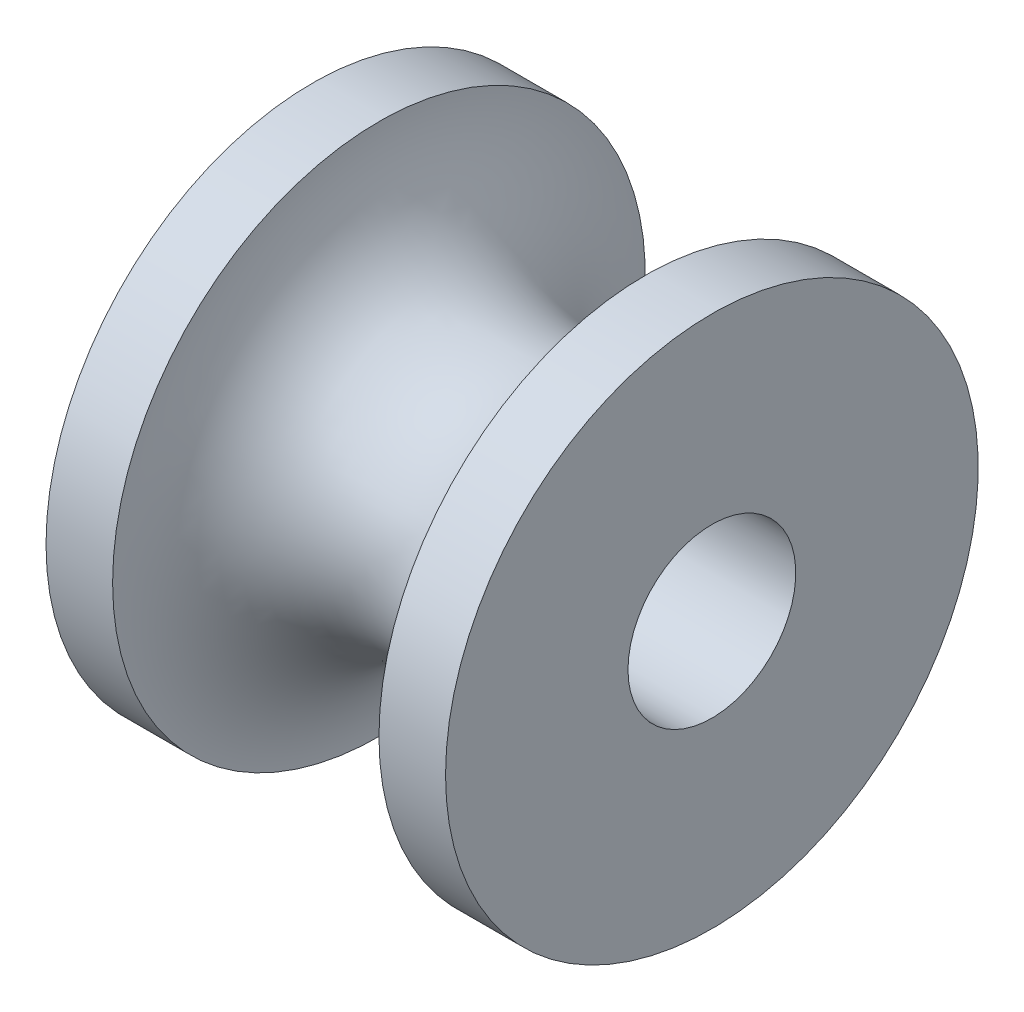
ISO-10303-21;
HEADER;
FILE_DESCRIPTION(('STEP AP214'),'2;1');
FILE_NAME('part.step','',(''),(''),'','','');
FILE_SCHEMA(('AUTOMOTIVE_DESIGN { 1 0 10303 214 1 1 1 1 }'));
ENDSEC;
DATA;
#1=APPLICATION_CONTEXT('core data for automotive mechanical design processes');
#2=APPLICATION_PROTOCOL_DEFINITION('international standard','automotive_design',2000,#1);
#3=PRODUCT_CONTEXT('',#1,'mechanical');
#4=PRODUCT('Part','Part','',(#3));
#5=PRODUCT_RELATED_PRODUCT_CATEGORY('part','',(#4));
#6=PRODUCT_DEFINITION_FORMATION('','',#4);
#7=PRODUCT_DEFINITION_CONTEXT('part definition',#1,'design');
#8=PRODUCT_DEFINITION('design','',#6,#7);
#9=PRODUCT_DEFINITION_SHAPE('','',#8);
#10=(LENGTH_UNIT() NAMED_UNIT(*) SI_UNIT(.MILLI.,.METRE.));
#11=(NAMED_UNIT(*) PLANE_ANGLE_UNIT() SI_UNIT($,.RADIAN.));
#12=(NAMED_UNIT(*) SI_UNIT($,.STERADIAN.) SOLID_ANGLE_UNIT());
#13=UNCERTAINTY_MEASURE_WITH_UNIT(LENGTH_MEASURE(1.E-05),#10,'distance_accuracy_value','');
#14=(GEOMETRIC_REPRESENTATION_CONTEXT(3) GLOBAL_UNCERTAINTY_ASSIGNED_CONTEXT((#13)) GLOBAL_UNIT_ASSIGNED_CONTEXT((#10,
#11,#12)) REPRESENTATION_CONTEXT('',''));
#15=CARTESIAN_POINT('',(0.,0.,0.));
#16=DIRECTION('',(0.,0.,1.));
#17=DIRECTION('',(1.,0.,0.));
#18=AXIS2_PLACEMENT_3D('',#15,#16,#17);
#19=CARTESIAN_POINT('',(2.38125,0.,0.));
#20=DIRECTION('',(-1.,0.,0.));
#21=DIRECTION('',(0.,0.,1.));
#22=AXIS2_PLACEMENT_3D('',#19,#20,#21);
#23=CYLINDRICAL_SURFACE('',#22,3.175);
#24=CARTESIAN_POINT('',(2.38125,0.,0.));
#25=DIRECTION('',(1.,0.,0.));
#26=DIRECTION('',(0.,0.,-1.));
#27=AXIS2_PLACEMENT_3D('',#24,#25,#26);
#28=CIRCLE('',#27,3.175);
#29=CARTESIAN_POINT('',(2.38125,0.,3.175));
#30=VERTEX_POINT('',#29);
#31=EDGE_CURVE('E10',#30,#30,#28,.T.);
#32=CARTESIAN_POINT('',(1.5875,0.,0.));
#33=DIRECTION('',(-1.,0.,0.));
#34=DIRECTION('',(0.,0.,1.));
#35=AXIS2_PLACEMENT_3D('',#32,#33,#34);
#36=CIRCLE('',#35,3.175);
#37=CARTESIAN_POINT('',(1.5875,0.,3.175));
#38=VERTEX_POINT('',#37);
#39=EDGE_CURVE('E36',#38,#38,#36,.T.);
#40=CARTESIAN_POINT('',(2.38125,0.,3.175));
#41=CARTESIAN_POINT('',(2.37298177083333,0.,3.175));
#42=CARTESIAN_POINT('',(2.36471354166667,0.,3.175));
#43=CARTESIAN_POINT('',(2.34817708333333,0.,3.175));
#44=CARTESIAN_POINT('',(2.33990885416667,0.,3.175));
#45=CARTESIAN_POINT('',(2.32337239583333,0.,3.175));
#46=CARTESIAN_POINT('',(2.31510416666667,0.,3.175));
#47=CARTESIAN_POINT('',(2.29856770833333,0.,3.175));
#48=CARTESIAN_POINT('',(2.29029947916667,0.,3.175));
#49=CARTESIAN_POINT('',(2.27376302083333,0.,3.175));
#50=CARTESIAN_POINT('',(2.26549479166667,0.,3.175));
#51=CARTESIAN_POINT('',(2.24895833333333,0.,3.175));
#52=CARTESIAN_POINT('',(2.24069010416667,0.,3.175));
#53=CARTESIAN_POINT('',(2.22415364583333,0.,3.175));
#54=CARTESIAN_POINT('',(2.21588541666667,0.,3.175));
#55=CARTESIAN_POINT('',(2.19934895833333,0.,3.175));
#56=CARTESIAN_POINT('',(2.19108072916667,0.,3.175));
#57=CARTESIAN_POINT('',(2.17454427083333,0.,3.175));
#58=CARTESIAN_POINT('',(2.16627604166667,0.,3.175));
#59=CARTESIAN_POINT('',(2.14973958333333,0.,3.175));
#60=CARTESIAN_POINT('',(2.14147135416667,0.,3.175));
#61=CARTESIAN_POINT('',(2.12493489583333,0.,3.175));
#62=CARTESIAN_POINT('',(2.11666666666667,0.,3.175));
#63=CARTESIAN_POINT('',(2.10013020833333,0.,3.175));
#64=CARTESIAN_POINT('',(2.09186197916667,0.,3.175));
#65=CARTESIAN_POINT('',(2.07532552083333,0.,3.175));
#66=CARTESIAN_POINT('',(2.06705729166667,0.,3.175));
#67=CARTESIAN_POINT('',(2.05052083333333,0.,3.175));
#68=CARTESIAN_POINT('',(2.04225260416667,0.,3.175));
#69=CARTESIAN_POINT('',(2.02571614583333,0.,3.175));
#70=CARTESIAN_POINT('',(2.01744791666667,0.,3.175));
#71=CARTESIAN_POINT('',(2.00091145833333,0.,3.175));
#72=CARTESIAN_POINT('',(1.99264322916667,0.,3.175));
#73=CARTESIAN_POINT('',(1.97610677083333,0.,3.175));
#74=CARTESIAN_POINT('',(1.96783854166667,0.,3.175));
#75=CARTESIAN_POINT('',(1.95130208333333,0.,3.175));
#76=CARTESIAN_POINT('',(1.94303385416667,0.,3.175));
#77=CARTESIAN_POINT('',(1.92649739583333,0.,3.175));
#78=CARTESIAN_POINT('',(1.91822916666667,0.,3.175));
#79=CARTESIAN_POINT('',(1.90169270833333,0.,3.175));
#80=CARTESIAN_POINT('',(1.89342447916667,0.,3.175));
#81=CARTESIAN_POINT('',(1.87688802083333,0.,3.175));
#82=CARTESIAN_POINT('',(1.86861979166667,0.,3.175));
#83=CARTESIAN_POINT('',(1.85208333333333,0.,3.175));
#84=CARTESIAN_POINT('',(1.84381510416667,0.,3.175));
#85=CARTESIAN_POINT('',(1.82727864583333,0.,3.175));
#86=CARTESIAN_POINT('',(1.81901041666667,0.,3.175));
#87=CARTESIAN_POINT('',(1.80247395833333,0.,3.175));
#88=CARTESIAN_POINT('',(1.79420572916667,0.,3.175));
#89=CARTESIAN_POINT('',(1.77766927083333,0.,3.175));
#90=CARTESIAN_POINT('',(1.76940104166667,0.,3.175));
#91=CARTESIAN_POINT('',(1.75286458333333,0.,3.175));
#92=CARTESIAN_POINT('',(1.74459635416667,0.,3.175));
#93=CARTESIAN_POINT('',(1.72805989583333,0.,3.175));
#94=CARTESIAN_POINT('',(1.71979166666667,0.,3.175));
#95=CARTESIAN_POINT('',(1.70325520833333,0.,3.175));
#96=CARTESIAN_POINT('',(1.69498697916667,0.,3.175));
#97=CARTESIAN_POINT('',(1.67845052083333,0.,3.175));
#98=CARTESIAN_POINT('',(1.67018229166667,0.,3.175));
#99=CARTESIAN_POINT('',(1.65364583333333,0.,3.175));
#100=CARTESIAN_POINT('',(1.64537760416667,0.,3.175));
#101=CARTESIAN_POINT('',(1.62884114583333,0.,3.175));
#102=CARTESIAN_POINT('',(1.62057291666667,0.,3.175));
#103=CARTESIAN_POINT('',(1.60403645833333,0.,3.175));
#104=CARTESIAN_POINT('',(1.59576822916667,0.,3.175));
#105=CARTESIAN_POINT('',(1.5875,0.,3.175));
#106=B_SPLINE_CURVE_WITH_KNOTS('',3,(#40,#41,#42,#43,#44,#45,#46,#47,#48,#49,#50,#51,#52,#53,
#54,#55,#56,#57,#58,#59,#60,#61,#62,#63,#64,#65,#66,#67,#68,#69,#70,#71,#72,#73,#74,#75,#76,#77,
#78,#79,#80,#81,#82,#83,#84,#85,#86,#87,#88,#89,#90,#91,#92,#93,#94,#95,#96,#97,#98,#99,#100,
#101,#102,#103,#104,#105),.UNSPECIFIED.,.F.,.F.,(4,2,2,2,2,2,2,2,2,2,2,2,2,2,2,2,2,2,2,2,2,2,2,
2,2,2,2,2,2,2,2,2,4),(0.,0.0248046875000003,0.0496093750000002,0.0744140625000005,
0.0992187500000004,0.1240234375,0.148828125000001,0.1736328125,0.1984375,0.223242187500001,
0.248046875,0.2728515625,0.297656250000001,0.3224609375,0.347265625,0.372070312500001,
0.396875000000001,0.4216796875,0.446484375000001,0.471289062500001,0.496093750000001,
0.520898437500001,0.545703125000001,0.570507812500001,0.595312500000001,0.620117187500001,
0.644921875000001,0.669726562500001,0.694531250000001,0.719335937500001,0.744140625000001,
0.768945312500001,0.793750000000001),.UNSPECIFIED.);
#107=EDGE_CURVE('BSEAM33',#30,#38,#106,.T.);
#108=ORIENTED_EDGE('',*,*,#31,.F.);
#109=ORIENTED_EDGE('',*,*,#39,.F.);
#110=ORIENTED_EDGE('',*,*,#107,.T.);
#111=ORIENTED_EDGE('',*,*,#107,.F.);
#112=EDGE_LOOP('',(#108,#110,#109,#111));
#113=FACE_BOUND('',#112,.T.);
#114=ADVANCED_FACE('F33',(#113),#23,.T.);
#115=CARTESIAN_POINT('',(-2.38125,0.,0.));
#116=DIRECTION('',(1.,0.,0.));
#117=DIRECTION('',(0.,0.,-1.));
#118=AXIS2_PLACEMENT_3D('',#115,#116,#117);
#119=CIRCLE('',#118,3.175);
#120=CARTESIAN_POINT('',(-2.38125,0.,3.175));
#121=VERTEX_POINT('',#120);
#122=EDGE_CURVE('E40',#121,#121,#119,.T.);
#123=CARTESIAN_POINT('',(-1.5875,0.,0.));
#124=DIRECTION('',(1.,0.,0.));
#125=DIRECTION('',(0.,0.,-1.));
#126=AXIS2_PLACEMENT_3D('',#123,#124,#125);
#127=CIRCLE('',#126,3.175);
#128=CARTESIAN_POINT('',(-1.5875,0.,3.175));
#129=VERTEX_POINT('',#128);
#130=EDGE_CURVE('E50',#129,#129,#127,.T.);
#131=CARTESIAN_POINT('',(-2.38125,0.,3.175));
#132=CARTESIAN_POINT('',(-2.37298177083333,0.,3.175));
#133=CARTESIAN_POINT('',(-2.36471354166667,0.,3.175));
#134=CARTESIAN_POINT('',(-2.34817708333333,0.,3.175));
#135=CARTESIAN_POINT('',(-2.33990885416667,0.,3.175));
#136=CARTESIAN_POINT('',(-2.32337239583333,0.,3.175));
#137=CARTESIAN_POINT('',(-2.31510416666667,0.,3.175));
#138=CARTESIAN_POINT('',(-2.29856770833333,0.,3.175));
#139=CARTESIAN_POINT('',(-2.29029947916667,0.,3.175));
#140=CARTESIAN_POINT('',(-2.27376302083333,0.,3.175));
#141=CARTESIAN_POINT('',(-2.26549479166667,0.,3.175));
#142=CARTESIAN_POINT('',(-2.24895833333333,0.,3.175));
#143=CARTESIAN_POINT('',(-2.24069010416667,0.,3.175));
#144=CARTESIAN_POINT('',(-2.22415364583333,0.,3.175));
#145=CARTESIAN_POINT('',(-2.21588541666667,0.,3.175));
#146=CARTESIAN_POINT('',(-2.19934895833333,0.,3.175));
#147=CARTESIAN_POINT('',(-2.19108072916667,0.,3.175));
#148=CARTESIAN_POINT('',(-2.17454427083333,0.,3.175));
#149=CARTESIAN_POINT('',(-2.16627604166667,0.,3.175));
#150=CARTESIAN_POINT('',(-2.14973958333333,0.,3.175));
#151=CARTESIAN_POINT('',(-2.14147135416667,0.,3.175));
#152=CARTESIAN_POINT('',(-2.12493489583333,0.,3.175));
#153=CARTESIAN_POINT('',(-2.11666666666667,0.,3.175));
#154=CARTESIAN_POINT('',(-2.10013020833333,0.,3.175));
#155=CARTESIAN_POINT('',(-2.09186197916667,0.,3.175));
#156=CARTESIAN_POINT('',(-2.07532552083333,0.,3.175));
#157=CARTESIAN_POINT('',(-2.06705729166667,0.,3.175));
#158=CARTESIAN_POINT('',(-2.05052083333333,0.,3.175));
#159=CARTESIAN_POINT('',(-2.04225260416667,0.,3.175));
#160=CARTESIAN_POINT('',(-2.02571614583333,0.,3.175));
#161=CARTESIAN_POINT('',(-2.01744791666667,0.,3.175));
#162=CARTESIAN_POINT('',(-2.00091145833333,0.,3.175));
#163=CARTESIAN_POINT('',(-1.99264322916667,0.,3.175));
#164=CARTESIAN_POINT('',(-1.97610677083333,0.,3.175));
#165=CARTESIAN_POINT('',(-1.96783854166667,0.,3.175));
#166=CARTESIAN_POINT('',(-1.95130208333333,0.,3.175));
#167=CARTESIAN_POINT('',(-1.94303385416667,0.,3.175));
#168=CARTESIAN_POINT('',(-1.92649739583333,0.,3.175));
#169=CARTESIAN_POINT('',(-1.91822916666667,0.,3.175));
#170=CARTESIAN_POINT('',(-1.90169270833333,0.,3.175));
#171=CARTESIAN_POINT('',(-1.89342447916667,0.,3.175));
#172=CARTESIAN_POINT('',(-1.87688802083333,0.,3.175));
#173=CARTESIAN_POINT('',(-1.86861979166667,0.,3.175));
#174=CARTESIAN_POINT('',(-1.85208333333333,0.,3.175));
#175=CARTESIAN_POINT('',(-1.84381510416667,0.,3.175));
#176=CARTESIAN_POINT('',(-1.82727864583333,0.,3.175));
#177=CARTESIAN_POINT('',(-1.81901041666667,0.,3.175));
#178=CARTESIAN_POINT('',(-1.80247395833333,0.,3.175));
#179=CARTESIAN_POINT('',(-1.79420572916667,0.,3.175));
#180=CARTESIAN_POINT('',(-1.77766927083333,0.,3.175));
#181=CARTESIAN_POINT('',(-1.76940104166667,0.,3.175));
#182=CARTESIAN_POINT('',(-1.75286458333333,0.,3.175));
#183=CARTESIAN_POINT('',(-1.74459635416667,0.,3.175));
#184=CARTESIAN_POINT('',(-1.72805989583333,0.,3.175));
#185=CARTESIAN_POINT('',(-1.71979166666667,0.,3.175));
#186=CARTESIAN_POINT('',(-1.70325520833333,0.,3.175));
#187=CARTESIAN_POINT('',(-1.69498697916667,0.,3.175));
#188=CARTESIAN_POINT('',(-1.67845052083333,0.,3.175));
#189=CARTESIAN_POINT('',(-1.67018229166667,0.,3.175));
#190=CARTESIAN_POINT('',(-1.65364583333333,0.,3.175));
#191=CARTESIAN_POINT('',(-1.64537760416667,0.,3.175));
#192=CARTESIAN_POINT('',(-1.62884114583333,0.,3.175));
#193=CARTESIAN_POINT('',(-1.62057291666667,0.,3.175));
#194=CARTESIAN_POINT('',(-1.60403645833333,0.,3.175));
#195=CARTESIAN_POINT('',(-1.59576822916667,0.,3.175));
#196=CARTESIAN_POINT('',(-1.5875,0.,3.175));
#197=B_SPLINE_CURVE_WITH_KNOTS('',3,(#131,#132,#133,#134,#135,#136,#137,#138,#139,#140,#141,
#142,#143,#144,#145,#146,#147,#148,#149,#150,#151,#152,#153,#154,#155,#156,#157,#158,#159,#160,
#161,#162,#163,#164,#165,#166,#167,#168,#169,#170,#171,#172,#173,#174,#175,#176,#177,#178,#179,
#180,#181,#182,#183,#184,#185,#186,#187,#188,#189,#190,#191,#192,#193,#194,#195,#196),
.UNSPECIFIED.,.F.,.F.,(4,2,2,2,2,2,2,2,2,2,2,2,2,2,2,2,2,2,2,2,2,2,2,2,2,2,2,2,2,2,2,2,4),(0.,
0.0248046875000003,0.0496093749999997,0.0744140625,0.0992187499999995,0.1240234375,0.148828125,
0.1736328125,0.1984375,0.2232421875,0.248046875,0.2728515625,0.29765625,0.3224609375,
0.347265625,0.372070312499999,0.396875,0.4216796875,0.446484374999999,0.4712890625,
0.496093749999999,0.520898437499999,0.545703125,0.570507812499999,0.595312499999999,
0.6201171875,0.644921874999999,0.6697265625,0.69453125,0.719335937499999,0.744140625,
0.768945312499999,0.793749999999999),.UNSPECIFIED.);
#198=EDGE_CURVE('BSEAM69',#121,#129,#197,.T.);
#199=ORIENTED_EDGE('',*,*,#122,.T.);
#200=ORIENTED_EDGE('',*,*,#130,.F.);
#201=ORIENTED_EDGE('',*,*,#198,.T.);
#202=ORIENTED_EDGE('',*,*,#198,.F.);
#203=EDGE_LOOP('',(#199,#201,#200,#202));
#204=FACE_BOUND('',#203,.T.);
#205=ADVANCED_FACE('F69',(#204),#23,.T.);
#206=CARTESIAN_POINT('',(2.38125,0.,0.));
#207=DIRECTION('',(1.,0.,0.));
#208=DIRECTION('',(0.,0.,-1.));
#209=AXIS2_PLACEMENT_3D('',#206,#207,#208);
#210=PLANE('',#209);
#211=ORIENTED_EDGE('',*,*,#31,.T.);
#212=EDGE_LOOP('',(#211));
#213=FACE_BOUND('',#212,.T.);
#214=CARTESIAN_POINT('',(2.38125,0.,0.));
#215=DIRECTION('',(1.,0.,0.));
#216=DIRECTION('',(0.,0.,-1.));
#217=AXIS2_PLACEMENT_3D('',#214,#215,#216);
#218=CIRCLE('',#217,1.);
#219=CARTESIAN_POINT('',(2.38125,0.,1.));
#220=VERTEX_POINT('',#219);
#221=EDGE_CURVE('E45',#220,#220,#218,.T.);
#222=ORIENTED_EDGE('',*,*,#221,.F.);
#223=EDGE_LOOP('',(#222));
#224=FACE_BOUND('',#223,.T.);
#225=ADVANCED_FACE('F66',(#213,#224),#210,.T.);
#226=CARTESIAN_POINT('',(-2.38125,0.,0.));
#227=DIRECTION('',(1.,0.,0.));
#228=DIRECTION('',(0.,0.,-1.));
#229=AXIS2_PLACEMENT_3D('',#226,#227,#228);
#230=PLANE('',#229);
#231=ORIENTED_EDGE('',*,*,#122,.F.);
#232=EDGE_LOOP('',(#231));
#233=FACE_BOUND('',#232,.T.);
#234=CARTESIAN_POINT('',(-2.38125,0.,0.));
#235=DIRECTION('',(1.,0.,0.));
#236=DIRECTION('',(0.,0.,-1.));
#237=AXIS2_PLACEMENT_3D('',#234,#235,#236);
#238=CIRCLE('',#237,1.);
#239=CARTESIAN_POINT('',(-2.38125,0.,1.));
#240=VERTEX_POINT('',#239);
#241=EDGE_CURVE('E48',#240,#240,#238,.T.);
#242=ORIENTED_EDGE('',*,*,#241,.T.);
#243=EDGE_LOOP('',(#242));
#244=FACE_BOUND('',#243,.T.);
#245=ADVANCED_FACE('F68',(#233,#244),#230,.F.);
#246=CARTESIAN_POINT('',(2.38125,0.,0.));
#247=DIRECTION('',(-1.,0.,0.));
#248=DIRECTION('',(0.,0.,1.));
#249=AXIS2_PLACEMENT_3D('',#246,#247,#248);
#250=CYLINDRICAL_SURFACE('',#249,1.);
#251=CARTESIAN_POINT('',(2.38125,0.,1.));
#252=CARTESIAN_POINT('',(2.331640625,0.,1.));
#253=CARTESIAN_POINT('',(2.28203125,0.,1.));
#254=CARTESIAN_POINT('',(2.1828125,0.,1.));
#255=CARTESIAN_POINT('',(2.133203125,0.,1.));
#256=CARTESIAN_POINT('',(2.033984375,0.,1.));
#257=CARTESIAN_POINT('',(1.984375,0.,1.));
#258=CARTESIAN_POINT('',(1.88515625,0.,1.));
#259=CARTESIAN_POINT('',(1.835546875,0.,1.));
#260=CARTESIAN_POINT('',(1.736328125,0.,1.));
#261=CARTESIAN_POINT('',(1.68671875,0.,1.));
#262=CARTESIAN_POINT('',(1.5875,0.,1.));
#263=CARTESIAN_POINT('',(1.537890625,0.,1.));
#264=CARTESIAN_POINT('',(1.438671875,0.,1.));
#265=CARTESIAN_POINT('',(1.3890625,0.,1.));
#266=CARTESIAN_POINT('',(1.28984375,0.,1.));
#267=CARTESIAN_POINT('',(1.240234375,0.,1.));
#268=CARTESIAN_POINT('',(1.141015625,0.,1.));
#269=CARTESIAN_POINT('',(1.09140625,0.,1.));
#270=CARTESIAN_POINT('',(0.9921875,0.,1.));
#271=CARTESIAN_POINT('',(0.942578125,0.,1.));
#272=CARTESIAN_POINT('',(0.843359375,0.,1.));
#273=CARTESIAN_POINT('',(0.79375,0.,1.));
#274=CARTESIAN_POINT('',(0.69453125,0.,1.));
#275=CARTESIAN_POINT('',(0.644921875,0.,1.));
#276=CARTESIAN_POINT('',(0.545703125,0.,1.));
#277=CARTESIAN_POINT('',(0.49609375,0.,1.));
#278=CARTESIAN_POINT('',(0.396875,0.,1.));
#279=CARTESIAN_POINT('',(0.347265625,0.,1.));
#280=CARTESIAN_POINT('',(0.248046875,0.,1.));
#281=CARTESIAN_POINT('',(0.1984375,0.,1.));
#282=CARTESIAN_POINT('',(0.0992187499999996,0.,1.));
#283=CARTESIAN_POINT('',(0.0496093749999996,0.,1.));
#284=CARTESIAN_POINT('',(-0.0496093750000005,0.,1.));
#285=CARTESIAN_POINT('',(-0.0992187500000005,0.,1.));
#286=CARTESIAN_POINT('',(-0.198437500000001,0.,1.));
#287=CARTESIAN_POINT('',(-0.248046875000001,0.,1.));
#288=CARTESIAN_POINT('',(-0.347265625000001,0.,1.));
#289=CARTESIAN_POINT('',(-0.396875000000001,0.,1.));
#290=CARTESIAN_POINT('',(-0.496093750000001,0.,1.));
#291=CARTESIAN_POINT('',(-0.545703125000001,0.,1.));
#292=CARTESIAN_POINT('',(-0.644921875000001,0.,1.));
#293=CARTESIAN_POINT('',(-0.694531250000001,0.,1.));
#294=CARTESIAN_POINT('',(-0.793750000000001,0.,1.));
#295=CARTESIAN_POINT('',(-0.843359375,0.,1.));
#296=CARTESIAN_POINT('',(-0.942578125000001,0.,1.));
#297=CARTESIAN_POINT('',(-0.992187500000001,0.,1.));
#298=CARTESIAN_POINT('',(-1.09140625,0.,1.));
#299=CARTESIAN_POINT('',(-1.141015625,0.,1.));
#300=CARTESIAN_POINT('',(-1.240234375,0.,1.));
#301=CARTESIAN_POINT('',(-1.28984375,0.,1.));
#302=CARTESIAN_POINT('',(-1.3890625,0.,1.));
#303=CARTESIAN_POINT('',(-1.438671875,0.,1.));
#304=CARTESIAN_POINT('',(-1.537890625,0.,1.));
#305=CARTESIAN_POINT('',(-1.5875,0.,1.));
#306=CARTESIAN_POINT('',(-1.68671875,0.,1.));
#307=CARTESIAN_POINT('',(-1.736328125,0.,1.));
#308=CARTESIAN_POINT('',(-1.835546875,0.,1.));
#309=CARTESIAN_POINT('',(-1.88515625,0.,1.));
#310=CARTESIAN_POINT('',(-1.984375,0.,1.));
#311=CARTESIAN_POINT('',(-2.033984375,0.,1.));
#312=CARTESIAN_POINT('',(-2.133203125,0.,1.));
#313=CARTESIAN_POINT('',(-2.1828125,0.,1.));
#314=CARTESIAN_POINT('',(-2.28203125,0.,1.));
#315=CARTESIAN_POINT('',(-2.331640625,0.,1.));
#316=CARTESIAN_POINT('',(-2.38125,0.,1.));
#317=B_SPLINE_CURVE_WITH_KNOTS('',3,(#251,#252,#253,#254,#255,#256,#257,#258,#259,#260,#261,
#262,#263,#264,#265,#266,#267,#268,#269,#270,#271,#272,#273,#274,#275,#276,#277,#278,#279,#280,
#281,#282,#283,#284,#285,#286,#287,#288,#289,#290,#291,#292,#293,#294,#295,#296,#297,#298,#299,
#300,#301,#302,#303,#304,#305,#306,#307,#308,#309,#310,#311,#312,#313,#314,#315,#316),
.UNSPECIFIED.,.F.,.F.,(4,2,2,2,2,2,2,2,2,2,2,2,2,2,2,2,2,2,2,2,2,2,2,2,2,2,2,2,2,2,2,2,4),(0.,
0.148828125,0.29765625,0.446484375,0.5953125,0.744140625,0.89296875,1.041796875,1.190625,
1.339453125,1.48828125,1.637109375,1.7859375,1.934765625,2.08359375,2.232421875,2.38125,
2.530078125,2.67890625,2.827734375,2.9765625,3.125390625,3.27421875,3.423046875,3.571875,
3.720703125,3.86953125,4.018359375,4.1671875,4.316015625,4.46484375,4.613671875,4.7625),.UNSPECIFIED.);
#318=EDGE_CURVE('BSEAM63',#220,#240,#317,.T.);
#319=ORIENTED_EDGE('',*,*,#221,.T.);
#320=ORIENTED_EDGE('',*,*,#241,.F.);
#321=ORIENTED_EDGE('',*,*,#318,.T.);
#322=ORIENTED_EDGE('',*,*,#318,.F.);
#323=EDGE_LOOP('',(#319,#321,#320,#322));
#324=FACE_BOUND('',#323,.T.);
#325=ADVANCED_FACE('F63',(#324),#250,.F.);
#326=CARTESIAN_POINT('',(0.,0.,0.));
#327=DIRECTION('',(1.,0.,0.));
#328=DIRECTION('',(0.,0.,-1.));
#329=AXIS2_PLACEMENT_3D('',#326,#327,#328);
#330=TOROIDAL_SURFACE('',#329,3.175,1.5875);
#331=ORIENTED_EDGE('',*,*,#130,.T.);
#332=EDGE_LOOP('',(#331));
#333=FACE_BOUND('',#332,.T.);
#334=ORIENTED_EDGE('',*,*,#39,.T.);
#335=EDGE_LOOP('',(#334));
#336=FACE_BOUND('',#335,.T.);
#337=ADVANCED_FACE('F94',(#333,#336),#330,.F.);
#338=CLOSED_SHELL('',(#114,#205,#225,#245,#325,#337));
#339=MANIFOLD_SOLID_BREP('B2',#338);
#340=ADVANCED_BREP_SHAPE_REPRESENTATION('',(#18,#339),#14);
#341=SHAPE_DEFINITION_REPRESENTATION(#9,#340);
ENDSEC;
END-ISO-10303-21;
